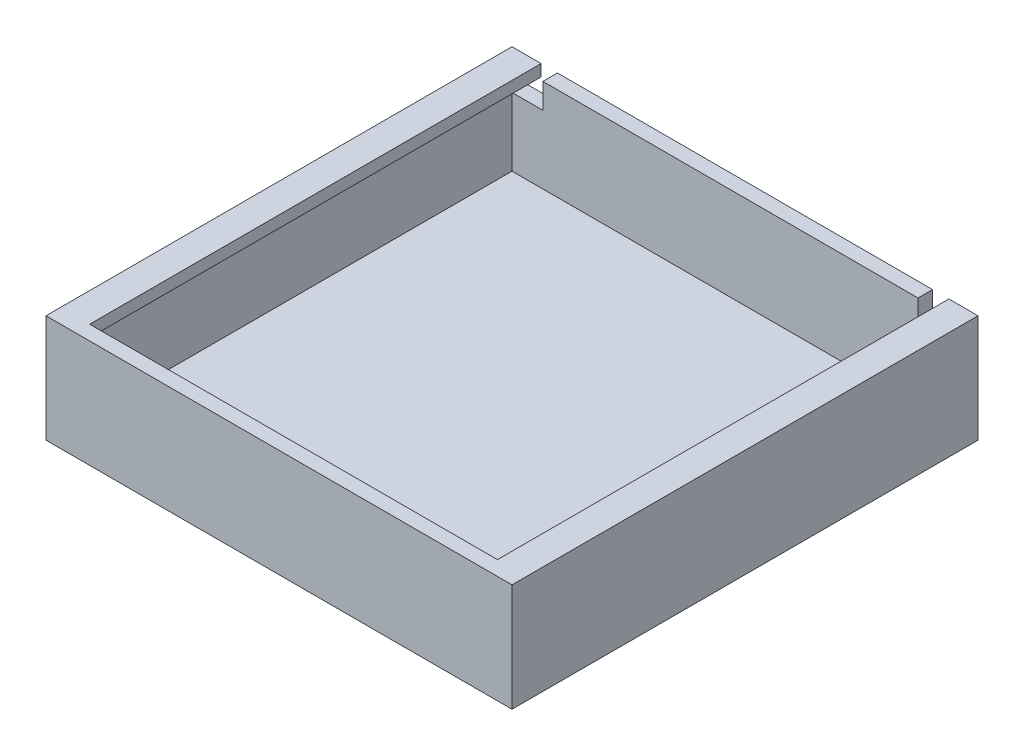
ISO-10303-21;
HEADER;
FILE_DESCRIPTION(('STEP AP214'),'2;1');
FILE_NAME('part.step','',(''),(''),'','','');
FILE_SCHEMA(('AUTOMOTIVE_DESIGN { 1 0 10303 214 1 1 1 1 }'));
ENDSEC;
DATA;
#1=APPLICATION_CONTEXT('core data for automotive mechanical design processes');
#2=APPLICATION_PROTOCOL_DEFINITION('international standard','automotive_design',2000,#1);
#3=PRODUCT_CONTEXT('',#1,'mechanical');
#4=PRODUCT('Part','Part','',(#3));
#5=PRODUCT_RELATED_PRODUCT_CATEGORY('part','',(#4));
#6=PRODUCT_DEFINITION_FORMATION('','',#4);
#7=PRODUCT_DEFINITION_CONTEXT('part definition',#1,'design');
#8=PRODUCT_DEFINITION('design','',#6,#7);
#9=PRODUCT_DEFINITION_SHAPE('','',#8);
#10=(LENGTH_UNIT() NAMED_UNIT(*) SI_UNIT(.MILLI.,.METRE.));
#11=(NAMED_UNIT(*) PLANE_ANGLE_UNIT() SI_UNIT($,.RADIAN.));
#12=(NAMED_UNIT(*) SI_UNIT($,.STERADIAN.) SOLID_ANGLE_UNIT());
#13=UNCERTAINTY_MEASURE_WITH_UNIT(LENGTH_MEASURE(1.E-05),#10,'distance_accuracy_value','');
#14=(GEOMETRIC_REPRESENTATION_CONTEXT(3) GLOBAL_UNCERTAINTY_ASSIGNED_CONTEXT((#13)) GLOBAL_UNIT_ASSIGNED_CONTEXT((#10,
#11,#12)) REPRESENTATION_CONTEXT('',''));
#15=CARTESIAN_POINT('',(0.,0.,0.));
#16=DIRECTION('',(0.,0.,1.));
#17=DIRECTION('',(1.,0.,0.));
#18=AXIS2_PLACEMENT_3D('',#15,#16,#17);
#19=CARTESIAN_POINT('',(-37.5,18.5,-37.5));
#20=DIRECTION('',(0.,0.,1.));
#21=DIRECTION('',(1.,0.,0.));
#22=AXIS2_PLACEMENT_3D('',#19,#20,#21);
#23=PLANE('',#22);
#24=DIRECTION('',(0.,1.,0.));
#25=VECTOR('',#24,1.);
#26=CARTESIAN_POINT('',(32.2,0.,-37.5));
#27=LINE('',#26,#25);
#28=CARTESIAN_POINT('',(32.2,14.2,-37.5));
#29=VERTEX_POINT('',#28);
#30=CARTESIAN_POINT('',(32.2,18.5,-37.5));
#31=VERTEX_POINT('',#30);
#32=EDGE_CURVE('E166',#29,#31,#27,.T.);
#33=ORIENTED_EDGE('',*,*,#32,.T.);
#34=DIRECTION('',(-1.,0.,0.));
#35=VECTOR('',#34,1.);
#36=CARTESIAN_POINT('',(-37.5,18.5,-37.5));
#37=LINE('',#36,#35);
#38=CARTESIAN_POINT('',(-32.2,18.5,-37.5));
#39=VERTEX_POINT('',#38);
#40=EDGE_CURVE('E180',#31,#39,#37,.T.);
#41=ORIENTED_EDGE('',*,*,#40,.T.);
#42=DIRECTION('',(0.,1.,0.));
#43=VECTOR('',#42,1.);
#44=CARTESIAN_POINT('',(-32.2,-1.03922038932936E-13,-37.5));
#45=LINE('',#44,#43);
#46=CARTESIAN_POINT('',(-32.2,14.1999999999999,-37.5));
#47=VERTEX_POINT('',#46);
#48=EDGE_CURVE('E280',#47,#39,#45,.T.);
#49=ORIENTED_EDGE('',*,*,#48,.F.);
#50=DIRECTION('',(1.,0.,0.));
#51=VECTOR('',#50,1.);
#52=CARTESIAN_POINT('',(0.,14.2,-37.5));
#53=LINE('',#52,#51);
#54=CARTESIAN_POINT('',(-37.5,14.1999999999999,-37.5));
#55=VERTEX_POINT('',#54);
#56=EDGE_CURVE('E287',#55,#47,#53,.T.);
#57=ORIENTED_EDGE('',*,*,#56,.F.);
#58=DIRECTION('',(0.,-1.,0.));
#59=VECTOR('',#58,1.);
#60=CARTESIAN_POINT('',(-37.5,18.5,-37.5));
#61=LINE('',#60,#59);
#62=CARTESIAN_POINT('',(-37.5,2.5,-37.5));
#63=VERTEX_POINT('',#62);
#64=EDGE_CURVE('E210',#55,#63,#61,.T.);
#65=ORIENTED_EDGE('',*,*,#64,.T.);
#66=DIRECTION('',(-1.,0.,0.));
#67=VECTOR('',#66,1.);
#68=CARTESIAN_POINT('',(-37.5,2.5,-37.5));
#69=LINE('',#68,#67);
#70=CARTESIAN_POINT('',(37.5,2.5,-37.5));
#71=VERTEX_POINT('',#70);
#72=EDGE_CURVE('E202',#71,#63,#69,.T.);
#73=ORIENTED_EDGE('',*,*,#72,.F.);
#74=DIRECTION('',(0.,-1.,0.));
#75=VECTOR('',#74,1.);
#76=CARTESIAN_POINT('',(37.5,18.5,-37.5));
#77=LINE('',#76,#75);
#78=CARTESIAN_POINT('',(37.5,14.2,-37.5));
#79=VERTEX_POINT('',#78);
#80=EDGE_CURVE('E212',#79,#71,#77,.T.);
#81=ORIENTED_EDGE('',*,*,#80,.F.);
#82=DIRECTION('',(-1.,0.,0.));
#83=VECTOR('',#82,1.);
#84=CARTESIAN_POINT('',(0.,14.2,-37.5));
#85=LINE('',#84,#83);
#86=EDGE_CURVE('E182',#79,#29,#85,.T.);
#87=ORIENTED_EDGE('',*,*,#86,.T.);
#88=EDGE_LOOP('',(#33,#41,#49,#57,#65,#73,#81,#87));
#89=FACE_BOUND('',#88,.T.);
#90=ADVANCED_FACE('F40',(#89),#23,.T.);
#91=CARTESIAN_POINT('',(-40.,2.5,-40.));
#92=DIRECTION('',(0.,0.,-1.));
#93=DIRECTION('',(-1.,0.,0.));
#94=AXIS2_PLACEMENT_3D('',#91,#92,#93);
#95=PLANE('',#94);
#96=DIRECTION('',(0.,1.,0.));
#97=VECTOR('',#96,1.);
#98=CARTESIAN_POINT('',(32.2,0.,-40.));
#99=LINE('',#98,#97);
#100=CARTESIAN_POINT('',(32.2,14.2,-40.));
#101=VERTEX_POINT('',#100);
#102=CARTESIAN_POINT('',(32.2,18.5,-40.));
#103=VERTEX_POINT('',#102);
#104=EDGE_CURVE('E169',#101,#103,#99,.T.);
#105=ORIENTED_EDGE('',*,*,#104,.F.);
#106=DIRECTION('',(-1.,0.,0.));
#107=VECTOR('',#106,1.);
#108=CARTESIAN_POINT('',(0.,14.2,-40.));
#109=LINE('',#108,#107);
#110=CARTESIAN_POINT('',(37.5,14.2,-40.));
#111=VERTEX_POINT('',#110);
#112=EDGE_CURVE('E291',#111,#101,#109,.T.);
#113=ORIENTED_EDGE('',*,*,#112,.F.);
#114=DIRECTION('',(0.,-1.,0.));
#115=VECTOR('',#114,1.);
#116=CARTESIAN_POINT('',(37.5,0.,-40.));
#117=LINE('',#116,#115);
#118=CARTESIAN_POINT('',(37.5,16.5,-40.));
#119=VERTEX_POINT('',#118);
#120=EDGE_CURVE('E183',#119,#111,#117,.T.);
#121=ORIENTED_EDGE('',*,*,#120,.F.);
#122=DIRECTION('',(1.,0.,0.));
#123=VECTOR('',#122,1.);
#124=CARTESIAN_POINT('',(0.,16.5,-40.));
#125=LINE('',#124,#123);
#126=CARTESIAN_POINT('',(35.,16.5,-40.));
#127=VERTEX_POINT('',#126);
#128=EDGE_CURVE('E309',#127,#119,#125,.T.);
#129=ORIENTED_EDGE('',*,*,#128,.F.);
#130=DIRECTION('',(0.,-1.,0.));
#131=VECTOR('',#130,1.);
#132=CARTESIAN_POINT('',(35.,0.,-40.));
#133=LINE('',#132,#131);
#134=CARTESIAN_POINT('',(35.,18.5,-40.));
#135=VERTEX_POINT('',#134);
#136=EDGE_CURVE('E306',#135,#127,#133,.T.);
#137=ORIENTED_EDGE('',*,*,#136,.F.);
#138=DIRECTION('',(-1.,0.,0.));
#139=VECTOR('',#138,1.);
#140=CARTESIAN_POINT('',(-40.,18.5,-40.));
#141=LINE('',#140,#139);
#142=CARTESIAN_POINT('',(40.,18.5,-40.));
#143=VERTEX_POINT('',#142);
#144=EDGE_CURVE('E218',#143,#135,#141,.T.);
#145=ORIENTED_EDGE('',*,*,#144,.F.);
#146=DIRECTION('',(0.,-1.,0.));
#147=VECTOR('',#146,1.);
#148=CARTESIAN_POINT('',(40.,2.5,-40.));
#149=LINE('',#148,#147);
#150=CARTESIAN_POINT('',(40.,0.,-40.));
#151=VERTEX_POINT('',#150);
#152=EDGE_CURVE('E245',#143,#151,#149,.T.);
#153=ORIENTED_EDGE('',*,*,#152,.T.);
#154=DIRECTION('',(1.,0.,0.));
#155=VECTOR('',#154,1.);
#156=CARTESIAN_POINT('',(-40.,0.,-40.));
#157=LINE('',#156,#155);
#158=CARTESIAN_POINT('',(-40.,0.,-40.));
#159=VERTEX_POINT('',#158);
#160=EDGE_CURVE('E230',#159,#151,#157,.T.);
#161=ORIENTED_EDGE('',*,*,#160,.F.);
#162=DIRECTION('',(0.,-1.,0.));
#163=VECTOR('',#162,1.);
#164=CARTESIAN_POINT('',(-40.,2.5,-40.));
#165=LINE('',#164,#163);
#166=CARTESIAN_POINT('',(-40.,18.5,-40.));
#167=VERTEX_POINT('',#166);
#168=EDGE_CURVE('E239',#167,#159,#165,.T.);
#169=ORIENTED_EDGE('',*,*,#168,.F.);
#170=CARTESIAN_POINT('',(-35.,18.5,-40.));
#171=VERTEX_POINT('',#170);
#172=EDGE_CURVE('E217',#171,#167,#141,.T.);
#173=ORIENTED_EDGE('',*,*,#172,.F.);
#174=DIRECTION('',(0.,-1.,0.));
#175=VECTOR('',#174,1.);
#176=CARTESIAN_POINT('',(-35.,0.,-40.));
#177=LINE('',#176,#175);
#178=CARTESIAN_POINT('',(-35.,16.4999999999999,-40.));
#179=VERTEX_POINT('',#178);
#180=EDGE_CURVE('E289',#171,#179,#177,.T.);
#181=ORIENTED_EDGE('',*,*,#180,.T.);
#182=DIRECTION('',(-1.,0.,0.));
#183=VECTOR('',#182,1.);
#184=CARTESIAN_POINT('',(0.,16.5,-40.));
#185=LINE('',#184,#183);
#186=CARTESIAN_POINT('',(-37.5,16.4999999999999,-40.));
#187=VERTEX_POINT('',#186);
#188=EDGE_CURVE('E264',#179,#187,#185,.T.);
#189=ORIENTED_EDGE('',*,*,#188,.T.);
#190=DIRECTION('',(0.,-1.,0.));
#191=VECTOR('',#190,1.);
#192=CARTESIAN_POINT('',(-37.4999999999999,-2.26268279475235E-13,-40.));
#193=LINE('',#192,#191);
#194=CARTESIAN_POINT('',(-37.5,14.1999999999999,-40.));
#195=VERTEX_POINT('',#194);
#196=EDGE_CURVE('E296',#187,#195,#193,.T.);
#197=ORIENTED_EDGE('',*,*,#196,.T.);
#198=DIRECTION('',(1.,0.,0.));
#199=VECTOR('',#198,1.);
#200=CARTESIAN_POINT('',(0.,14.2,-40.));
#201=LINE('',#200,#199);
#202=CARTESIAN_POINT('',(-32.2,14.1999999999999,-40.));
#203=VERTEX_POINT('',#202);
#204=EDGE_CURVE('E285',#195,#203,#201,.T.);
#205=ORIENTED_EDGE('',*,*,#204,.T.);
#206=DIRECTION('',(0.,1.,0.));
#207=VECTOR('',#206,1.);
#208=CARTESIAN_POINT('',(-32.2,-1.03922038932936E-13,-40.));
#209=LINE('',#208,#207);
#210=CARTESIAN_POINT('',(-32.2,18.5,-40.));
#211=VERTEX_POINT('',#210);
#212=EDGE_CURVE('E282',#203,#211,#209,.T.);
#213=ORIENTED_EDGE('',*,*,#212,.T.);
#214=EDGE_CURVE('E222',#103,#211,#141,.T.);
#215=ORIENTED_EDGE('',*,*,#214,.F.);
#216=EDGE_LOOP('',(#105,#113,#121,#129,#137,#145,#153,#161,#169,#173,#181,#189,#197,#205,#213,#215));
#217=FACE_BOUND('',#216,.T.);
#218=ADVANCED_FACE('F320',(#217),#95,.T.);
#219=CARTESIAN_POINT('',(0.,18.5,0.));
#220=DIRECTION('',(0.,1.,0.));
#221=DIRECTION('',(0.,0.,1.));
#222=AXIS2_PLACEMENT_3D('',#219,#220,#221);
#223=PLANE('',#222);
#224=DIRECTION('',(0.,0.,-1.));
#225=VECTOR('',#224,1.);
#226=CARTESIAN_POINT('',(32.2,18.5,-30.6750457876993));
#227=LINE('',#226,#225);
#228=EDGE_CURVE('E163',#31,#103,#227,.T.);
#229=ORIENTED_EDGE('',*,*,#228,.T.);
#230=ORIENTED_EDGE('',*,*,#214,.T.);
#231=DIRECTION('',(0.,0.,-1.));
#232=VECTOR('',#231,1.);
#233=CARTESIAN_POINT('',(-32.2,18.5,-30.6750457876993));
#234=LINE('',#233,#232);
#235=EDGE_CURVE('E187',#39,#211,#234,.T.);
#236=ORIENTED_EDGE('',*,*,#235,.F.);
#237=ORIENTED_EDGE('',*,*,#40,.F.);
#238=EDGE_LOOP('',(#229,#230,#236,#237));
#239=FACE_BOUND('',#238,.T.);
#240=ADVANCED_FACE('F186',(#239),#223,.T.);
#241=ORIENTED_EDGE('',*,*,#144,.T.);
#242=DIRECTION('',(0.,0.,1.));
#243=VECTOR('',#242,1.);
#244=CARTESIAN_POINT('',(35.,18.5,-40.002));
#245=LINE('',#244,#243);
#246=CARTESIAN_POINT('',(35.,18.5,37.5));
#247=VERTEX_POINT('',#246);
#248=EDGE_CURVE('E274',#135,#247,#245,.T.);
#249=ORIENTED_EDGE('',*,*,#248,.T.);
#250=DIRECTION('',(1.,0.,0.));
#251=VECTOR('',#250,1.);
#252=CARTESIAN_POINT('',(-37.5,18.5,37.5));
#253=LINE('',#252,#251);
#254=CARTESIAN_POINT('',(-35.,18.5,37.5));
#255=VERTEX_POINT('',#254);
#256=EDGE_CURVE('E60',#255,#247,#253,.T.);
#257=ORIENTED_EDGE('',*,*,#256,.F.);
#258=DIRECTION('',(0.,0.,1.));
#259=VECTOR('',#258,1.);
#260=CARTESIAN_POINT('',(-35.,18.5,-40.002));
#261=LINE('',#260,#259);
#262=EDGE_CURVE('E261',#171,#255,#261,.T.);
#263=ORIENTED_EDGE('',*,*,#262,.F.);
#264=ORIENTED_EDGE('',*,*,#172,.T.);
#265=DIRECTION('',(0.,0.,1.));
#266=VECTOR('',#265,1.);
#267=CARTESIAN_POINT('',(-40.,18.5,-40.));
#268=LINE('',#267,#266);
#269=CARTESIAN_POINT('',(-40.,18.5,40.));
#270=VERTEX_POINT('',#269);
#271=EDGE_CURVE('E221',#167,#270,#268,.T.);
#272=ORIENTED_EDGE('',*,*,#271,.T.);
#273=DIRECTION('',(1.,0.,0.));
#274=VECTOR('',#273,1.);
#275=CARTESIAN_POINT('',(-40.,18.5,40.));
#276=LINE('',#275,#274);
#277=CARTESIAN_POINT('',(40.,18.5,40.));
#278=VERTEX_POINT('',#277);
#279=EDGE_CURVE('E225',#270,#278,#276,.T.);
#280=ORIENTED_EDGE('',*,*,#279,.T.);
#281=DIRECTION('',(0.,0.,-1.));
#282=VECTOR('',#281,1.);
#283=CARTESIAN_POINT('',(40.,18.5,-40.));
#284=LINE('',#283,#282);
#285=EDGE_CURVE('E214',#278,#143,#284,.T.);
#286=ORIENTED_EDGE('',*,*,#285,.T.);
#287=EDGE_LOOP('',(#241,#249,#257,#263,#264,#272,#280,#286));
#288=FACE_BOUND('',#287,.T.);
#289=ADVANCED_FACE('F350',(#288),#223,.T.);
#290=CARTESIAN_POINT('',(-37.5,18.5,-37.5));
#291=DIRECTION('',(1.,0.,0.));
#292=DIRECTION('',(0.,0.,-1.));
#293=AXIS2_PLACEMENT_3D('',#290,#291,#292);
#294=PLANE('',#293);
#295=ORIENTED_EDGE('',*,*,#64,.F.);
#296=DIRECTION('',(0.,0.,-1.));
#297=VECTOR('',#296,1.);
#298=CARTESIAN_POINT('',(-37.5,14.1999999999999,-30.6750457876993));
#299=LINE('',#298,#297);
#300=EDGE_CURVE('E283',#55,#195,#299,.T.);
#301=ORIENTED_EDGE('',*,*,#300,.T.);
#302=ORIENTED_EDGE('',*,*,#196,.F.);
#303=DIRECTION('',(0.,0.,1.));
#304=VECTOR('',#303,1.);
#305=CARTESIAN_POINT('',(-37.5,16.5,-37.5));
#306=LINE('',#305,#304);
#307=CARTESIAN_POINT('',(-37.5,16.5,37.5));
#308=VERTEX_POINT('',#307);
#309=EDGE_CURVE('E196',#187,#308,#306,.T.);
#310=ORIENTED_EDGE('',*,*,#309,.T.);
#311=DIRECTION('',(0.,-1.,0.));
#312=VECTOR('',#311,1.);
#313=CARTESIAN_POINT('',(-37.5,18.5,37.5));
#314=LINE('',#313,#312);
#315=CARTESIAN_POINT('',(-37.5,2.5,37.5));
#316=VERTEX_POINT('',#315);
#317=EDGE_CURVE('E208',#308,#316,#314,.T.);
#318=ORIENTED_EDGE('',*,*,#317,.T.);
#319=DIRECTION('',(0.,0.,1.));
#320=VECTOR('',#319,1.);
#321=CARTESIAN_POINT('',(-37.5,2.5,-37.5));
#322=LINE('',#321,#320);
#323=EDGE_CURVE('E193',#63,#316,#322,.T.);
#324=ORIENTED_EDGE('',*,*,#323,.F.);
#325=EDGE_LOOP('',(#295,#301,#302,#310,#318,#324));
#326=FACE_BOUND('',#325,.T.);
#327=ADVANCED_FACE('F342',(#326),#294,.T.);
#328=CARTESIAN_POINT('',(-37.5,18.5,37.5));
#329=DIRECTION('',(0.,0.,-1.));
#330=DIRECTION('',(-1.,0.,0.));
#331=AXIS2_PLACEMENT_3D('',#328,#329,#330);
#332=PLANE('',#331);
#333=DIRECTION('',(0.,1.,0.));
#334=VECTOR('',#333,1.);
#335=CARTESIAN_POINT('',(35.,18.5,37.5));
#336=LINE('',#335,#334);
#337=CARTESIAN_POINT('',(35.,16.5,37.5));
#338=VERTEX_POINT('',#337);
#339=EDGE_CURVE('E55',#338,#247,#336,.T.);
#340=ORIENTED_EDGE('',*,*,#339,.F.);
#341=DIRECTION('',(-1.,0.,0.));
#342=VECTOR('',#341,1.);
#343=CARTESIAN_POINT('',(-37.5,16.4999999999986,37.5));
#344=LINE('',#343,#342);
#345=CARTESIAN_POINT('',(37.5,16.5,37.5));
#346=VERTEX_POINT('',#345);
#347=EDGE_CURVE('E267',#346,#338,#344,.T.);
#348=ORIENTED_EDGE('',*,*,#347,.F.);
#349=DIRECTION('',(0.,-1.,0.));
#350=VECTOR('',#349,1.);
#351=CARTESIAN_POINT('',(37.5,18.5,37.5));
#352=LINE('',#351,#350);
#353=CARTESIAN_POINT('',(37.5,2.5,37.5));
#354=VERTEX_POINT('',#353);
#355=EDGE_CURVE('E190',#346,#354,#352,.T.);
#356=ORIENTED_EDGE('',*,*,#355,.T.);
#357=DIRECTION('',(1.,0.,0.));
#358=VECTOR('',#357,1.);
#359=CARTESIAN_POINT('',(-37.5,2.5,37.5));
#360=LINE('',#359,#358);
#361=EDGE_CURVE('E188',#316,#354,#360,.T.);
#362=ORIENTED_EDGE('',*,*,#361,.F.);
#363=ORIENTED_EDGE('',*,*,#317,.F.);
#364=DIRECTION('',(1.,0.,0.));
#365=VECTOR('',#364,1.);
#366=CARTESIAN_POINT('',(-37.5,16.5,37.5));
#367=LINE('',#366,#365);
#368=CARTESIAN_POINT('',(-35.,16.5,37.5));
#369=VERTEX_POINT('',#368);
#370=EDGE_CURVE('E48',#308,#369,#367,.T.);
#371=ORIENTED_EDGE('',*,*,#370,.T.);
#372=DIRECTION('',(0.,1.,0.));
#373=VECTOR('',#372,1.);
#374=CARTESIAN_POINT('',(-35.,18.5,37.5));
#375=LINE('',#374,#373);
#376=EDGE_CURVE('E242',#369,#255,#375,.T.);
#377=ORIENTED_EDGE('',*,*,#376,.T.);
#378=ORIENTED_EDGE('',*,*,#256,.T.);
#379=EDGE_LOOP('',(#340,#348,#356,#362,#363,#371,#377,#378));
#380=FACE_BOUND('',#379,.T.);
#381=ADVANCED_FACE('F251',(#380),#332,.T.);
#382=CARTESIAN_POINT('',(-40.,2.5,40.));
#383=DIRECTION('',(-1.,0.,0.));
#384=DIRECTION('',(0.,0.,1.));
#385=AXIS2_PLACEMENT_3D('',#382,#383,#384);
#386=PLANE('',#385);
#387=ORIENTED_EDGE('',*,*,#168,.T.);
#388=DIRECTION('',(0.,0.,-1.));
#389=VECTOR('',#388,1.);
#390=CARTESIAN_POINT('',(-40.,0.,40.));
#391=LINE('',#390,#389);
#392=CARTESIAN_POINT('',(-40.,0.,40.));
#393=VERTEX_POINT('',#392);
#394=EDGE_CURVE('E227',#393,#159,#391,.T.);
#395=ORIENTED_EDGE('',*,*,#394,.F.);
#396=DIRECTION('',(0.,-1.,0.));
#397=VECTOR('',#396,1.);
#398=CARTESIAN_POINT('',(-40.,2.5,40.));
#399=LINE('',#398,#397);
#400=EDGE_CURVE('E240',#270,#393,#399,.T.);
#401=ORIENTED_EDGE('',*,*,#400,.F.);
#402=ORIENTED_EDGE('',*,*,#271,.F.);
#403=EDGE_LOOP('',(#387,#395,#401,#402));
#404=FACE_BOUND('',#403,.T.);
#405=ADVANCED_FACE('F42',(#404),#386,.T.);
#406=CARTESIAN_POINT('',(-40.,2.5,40.));
#407=DIRECTION('',(0.,0.,-1.));
#408=DIRECTION('',(-1.,0.,0.));
#409=AXIS2_PLACEMENT_3D('',#406,#407,#408);
#410=PLANE('',#409);
#411=DIRECTION('',(0.,-1.,0.));
#412=VECTOR('',#411,1.);
#413=CARTESIAN_POINT('',(40.,2.5,40.));
#414=LINE('',#413,#412);
#415=CARTESIAN_POINT('',(40.,0.,40.));
#416=VERTEX_POINT('',#415);
#417=EDGE_CURVE('E243',#278,#416,#414,.T.);
#418=ORIENTED_EDGE('',*,*,#417,.F.);
#419=ORIENTED_EDGE('',*,*,#279,.F.);
#420=ORIENTED_EDGE('',*,*,#400,.T.);
#421=DIRECTION('',(1.,0.,0.));
#422=VECTOR('',#421,1.);
#423=CARTESIAN_POINT('',(-40.,0.,40.));
#424=LINE('',#423,#422);
#425=EDGE_CURVE('E236',#393,#416,#424,.T.);
#426=ORIENTED_EDGE('',*,*,#425,.T.);
#427=EDGE_LOOP('',(#418,#419,#420,#426));
#428=FACE_BOUND('',#427,.T.);
#429=ADVANCED_FACE('F358',(#428),#410,.F.);
#430=CARTESIAN_POINT('',(40.,2.5,40.));
#431=DIRECTION('',(-1.,0.,0.));
#432=DIRECTION('',(0.,0.,1.));
#433=AXIS2_PLACEMENT_3D('',#430,#431,#432);
#434=PLANE('',#433);
#435=DIRECTION('',(0.,0.,-1.));
#436=VECTOR('',#435,1.);
#437=CARTESIAN_POINT('',(40.,0.,40.));
#438=LINE('',#437,#436);
#439=EDGE_CURVE('E233',#416,#151,#438,.T.);
#440=ORIENTED_EDGE('',*,*,#439,.T.);
#441=ORIENTED_EDGE('',*,*,#152,.F.);
#442=ORIENTED_EDGE('',*,*,#285,.F.);
#443=ORIENTED_EDGE('',*,*,#417,.T.);
#444=EDGE_LOOP('',(#440,#441,#442,#443));
#445=FACE_BOUND('',#444,.T.);
#446=ADVANCED_FACE('F356',(#445),#434,.F.);
#447=CARTESIAN_POINT('',(0.,0.,0.));
#448=DIRECTION('',(0.,-1.,0.));
#449=DIRECTION('',(0.,0.,-1.));
#450=AXIS2_PLACEMENT_3D('',#447,#448,#449);
#451=PLANE('',#450);
#452=ORIENTED_EDGE('',*,*,#394,.T.);
#453=ORIENTED_EDGE('',*,*,#160,.T.);
#454=ORIENTED_EDGE('',*,*,#439,.F.);
#455=ORIENTED_EDGE('',*,*,#425,.F.);
#456=EDGE_LOOP('',(#452,#453,#454,#455));
#457=FACE_BOUND('',#456,.T.);
#458=ADVANCED_FACE('F347',(#457),#451,.T.);
#459=CARTESIAN_POINT('',(37.5,18.5,-37.5));
#460=DIRECTION('',(-1.,0.,0.));
#461=DIRECTION('',(0.,0.,1.));
#462=AXIS2_PLACEMENT_3D('',#459,#460,#461);
#463=PLANE('',#462);
#464=DIRECTION('',(0.,0.,1.));
#465=VECTOR('',#464,1.);
#466=CARTESIAN_POINT('',(37.5,16.5,-37.5));
#467=LINE('',#466,#465);
#468=EDGE_CURVE('E11',#119,#346,#467,.T.);
#469=ORIENTED_EDGE('',*,*,#468,.F.);
#470=ORIENTED_EDGE('',*,*,#120,.T.);
#471=DIRECTION('',(0.,0.,-1.));
#472=VECTOR('',#471,1.);
#473=CARTESIAN_POINT('',(37.5,14.2,-30.6750457876993));
#474=LINE('',#473,#472);
#475=EDGE_CURVE('E174',#79,#111,#474,.T.);
#476=ORIENTED_EDGE('',*,*,#475,.F.);
#477=ORIENTED_EDGE('',*,*,#80,.T.);
#478=DIRECTION('',(0.,0.,-1.));
#479=VECTOR('',#478,1.);
#480=CARTESIAN_POINT('',(37.5,2.5,-37.5));
#481=LINE('',#480,#479);
#482=EDGE_CURVE('E199',#354,#71,#481,.T.);
#483=ORIENTED_EDGE('',*,*,#482,.F.);
#484=ORIENTED_EDGE('',*,*,#355,.F.);
#485=EDGE_LOOP('',(#469,#470,#476,#477,#483,#484));
#486=FACE_BOUND('',#485,.T.);
#487=ADVANCED_FACE('F317',(#486),#463,.T.);
#488=CARTESIAN_POINT('',(0.,2.5,0.));
#489=DIRECTION('',(0.,-1.,0.));
#490=DIRECTION('',(0.,0.,-1.));
#491=AXIS2_PLACEMENT_3D('',#488,#489,#490);
#492=PLANE('',#491);
#493=ORIENTED_EDGE('',*,*,#361,.T.);
#494=ORIENTED_EDGE('',*,*,#482,.T.);
#495=ORIENTED_EDGE('',*,*,#72,.T.);
#496=ORIENTED_EDGE('',*,*,#323,.T.);
#497=EDGE_LOOP('',(#493,#494,#495,#496));
#498=FACE_BOUND('',#497,.T.);
#499=ADVANCED_FACE('F346',(#498),#492,.F.);
#500=CARTESIAN_POINT('',(0.,16.5,-40.002));
#501=DIRECTION('',(0.,1.,0.));
#502=DIRECTION('',(-1.,0.,0.));
#503=AXIS2_PLACEMENT_3D('',#500,#501,#502);
#504=PLANE('',#503);
#505=ORIENTED_EDGE('',*,*,#309,.F.);
#506=ORIENTED_EDGE('',*,*,#188,.F.);
#507=DIRECTION('',(0.,0.,1.));
#508=VECTOR('',#507,1.);
#509=CARTESIAN_POINT('',(-35.,16.5,-40.002));
#510=LINE('',#509,#508);
#511=EDGE_CURVE('E259',#179,#369,#510,.T.);
#512=ORIENTED_EDGE('',*,*,#511,.T.);
#513=ORIENTED_EDGE('',*,*,#370,.F.);
#514=EDGE_LOOP('',(#505,#506,#512,#513));
#515=FACE_BOUND('',#514,.T.);
#516=ADVANCED_FACE('F262',(#515),#504,.F.);
#517=CARTESIAN_POINT('',(-35.,0.,-40.002));
#518=DIRECTION('',(-1.,0.,0.));
#519=DIRECTION('',(0.,0.,1.));
#520=AXIS2_PLACEMENT_3D('',#517,#518,#519);
#521=PLANE('',#520);
#522=ORIENTED_EDGE('',*,*,#511,.F.);
#523=ORIENTED_EDGE('',*,*,#180,.F.);
#524=ORIENTED_EDGE('',*,*,#262,.T.);
#525=ORIENTED_EDGE('',*,*,#376,.F.);
#526=EDGE_LOOP('',(#522,#523,#524,#525));
#527=FACE_BOUND('',#526,.T.);
#528=ADVANCED_FACE('F257',(#527),#521,.F.);
#529=CARTESIAN_POINT('',(35.,0.,-40.002));
#530=DIRECTION('',(-1.,0.,0.));
#531=DIRECTION('',(0.,0.,1.));
#532=AXIS2_PLACEMENT_3D('',#529,#530,#531);
#533=PLANE('',#532);
#534=ORIENTED_EDGE('',*,*,#248,.F.);
#535=ORIENTED_EDGE('',*,*,#136,.T.);
#536=DIRECTION('',(0.,0.,1.));
#537=VECTOR('',#536,1.);
#538=CARTESIAN_POINT('',(35.,16.5,-40.002));
#539=LINE('',#538,#537);
#540=EDGE_CURVE('E271',#127,#338,#539,.T.);
#541=ORIENTED_EDGE('',*,*,#540,.T.);
#542=ORIENTED_EDGE('',*,*,#339,.T.);
#543=EDGE_LOOP('',(#534,#535,#541,#542));
#544=FACE_BOUND('',#543,.T.);
#545=ADVANCED_FACE('F393',(#544),#533,.T.);
#546=CARTESIAN_POINT('',(-3.09127723419056E-13,16.4999999999993,-40.002));
#547=DIRECTION('',(0.,-1.,0.));
#548=DIRECTION('',(1.,0.,0.));
#549=AXIS2_PLACEMENT_3D('',#546,#547,#548);
#550=PLANE('',#549);
#551=ORIENTED_EDGE('',*,*,#540,.F.);
#552=ORIENTED_EDGE('',*,*,#128,.T.);
#553=ORIENTED_EDGE('',*,*,#468,.T.);
#554=ORIENTED_EDGE('',*,*,#347,.T.);
#555=EDGE_LOOP('',(#551,#552,#553,#554));
#556=FACE_BOUND('',#555,.T.);
#557=ADVANCED_FACE('F333',(#556),#550,.T.);
#558=CARTESIAN_POINT('',(32.2,0.,-30.6750457876993));
#559=DIRECTION('',(-1.,0.,0.));
#560=DIRECTION('',(0.,0.,1.));
#561=AXIS2_PLACEMENT_3D('',#558,#559,#560);
#562=PLANE('',#561);
#563=DIRECTION('',(0.,0.,-1.));
#564=VECTOR('',#563,1.);
#565=CARTESIAN_POINT('',(32.2,14.2,-30.6750457876993));
#566=LINE('',#565,#564);
#567=EDGE_CURVE('E277',#29,#101,#566,.T.);
#568=ORIENTED_EDGE('',*,*,#567,.T.);
#569=ORIENTED_EDGE('',*,*,#104,.T.);
#570=ORIENTED_EDGE('',*,*,#228,.F.);
#571=ORIENTED_EDGE('',*,*,#32,.F.);
#572=EDGE_LOOP('',(#568,#569,#570,#571));
#573=FACE_BOUND('',#572,.T.);
#574=ADVANCED_FACE('F165',(#573),#562,.F.);
#575=CARTESIAN_POINT('',(0.,14.2,-30.6750457876993));
#576=DIRECTION('',(0.,-1.,0.));
#577=DIRECTION('',(0.,0.,-1.));
#578=AXIS2_PLACEMENT_3D('',#575,#576,#577);
#579=PLANE('',#578);
#580=ORIENTED_EDGE('',*,*,#475,.T.);
#581=ORIENTED_EDGE('',*,*,#112,.T.);
#582=ORIENTED_EDGE('',*,*,#567,.F.);
#583=ORIENTED_EDGE('',*,*,#86,.F.);
#584=EDGE_LOOP('',(#580,#581,#582,#583));
#585=FACE_BOUND('',#584,.T.);
#586=ADVANCED_FACE('F322',(#585),#579,.F.);
#587=CARTESIAN_POINT('',(-32.2,-1.03922038932936E-13,-30.6750457876993));
#588=DIRECTION('',(-1.,0.,0.));
#589=DIRECTION('',(0.,-1.,0.));
#590=AXIS2_PLACEMENT_3D('',#587,#588,#589);
#591=PLANE('',#590);
#592=ORIENTED_EDGE('',*,*,#48,.T.);
#593=ORIENTED_EDGE('',*,*,#235,.T.);
#594=ORIENTED_EDGE('',*,*,#212,.F.);
#595=DIRECTION('',(0.,0.,-1.));
#596=VECTOR('',#595,1.);
#597=CARTESIAN_POINT('',(-32.2,14.1999999999999,-30.6750457876993));
#598=LINE('',#597,#596);
#599=EDGE_CURVE('E279',#47,#203,#598,.T.);
#600=ORIENTED_EDGE('',*,*,#599,.F.);
#601=EDGE_LOOP('',(#592,#593,#594,#600));
#602=FACE_BOUND('',#601,.T.);
#603=ADVANCED_FACE('F324',(#602),#591,.T.);
#604=CARTESIAN_POINT('',(0.,14.2,-30.6750457876993));
#605=DIRECTION('',(0.,1.,0.));
#606=DIRECTION('',(-1.,0.,0.));
#607=AXIS2_PLACEMENT_3D('',#604,#605,#606);
#608=PLANE('',#607);
#609=ORIENTED_EDGE('',*,*,#56,.T.);
#610=ORIENTED_EDGE('',*,*,#599,.T.);
#611=ORIENTED_EDGE('',*,*,#204,.F.);
#612=ORIENTED_EDGE('',*,*,#300,.F.);
#613=EDGE_LOOP('',(#609,#610,#611,#612));
#614=FACE_BOUND('',#613,.T.);
#615=ADVANCED_FACE('F330',(#614),#608,.T.);
#616=CLOSED_SHELL('',(#90,#218,#240,#289,#327,#381,#405,#429,#446,#458,#487,#499,#516,#528,#545,
#557,#574,#586,#603,#615));
#617=MANIFOLD_SOLID_BREP('B2',#616);
#618=ADVANCED_BREP_SHAPE_REPRESENTATION('',(#18,#617),#14);
#619=SHAPE_DEFINITION_REPRESENTATION(#9,#618);
ENDSEC;
END-ISO-10303-21;
